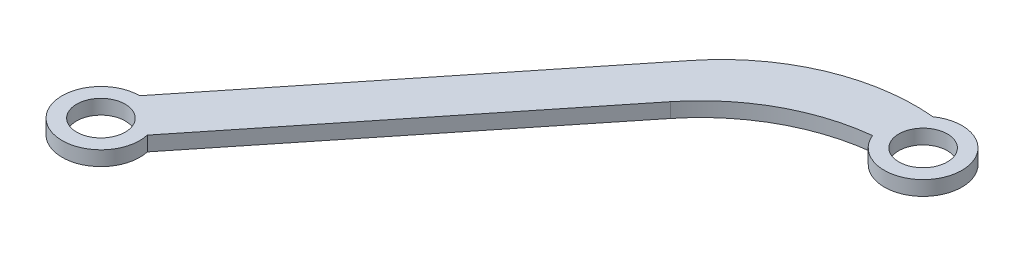
ISO-10303-21;
HEADER;
FILE_DESCRIPTION(('STEP AP214'),'2;1');
FILE_NAME('part.step','',(''),(''),'','','');
FILE_SCHEMA(('AUTOMOTIVE_DESIGN { 1 0 10303 214 1 1 1 1 }'));
ENDSEC;
DATA;
#1=APPLICATION_CONTEXT('core data for automotive mechanical design processes');
#2=APPLICATION_PROTOCOL_DEFINITION('international standard','automotive_design',2000,#1);
#3=PRODUCT_CONTEXT('',#1,'mechanical');
#4=PRODUCT('Part','Part','',(#3));
#5=PRODUCT_RELATED_PRODUCT_CATEGORY('part','',(#4));
#6=PRODUCT_DEFINITION_FORMATION('','',#4);
#7=PRODUCT_DEFINITION_CONTEXT('part definition',#1,'design');
#8=PRODUCT_DEFINITION('design','',#6,#7);
#9=PRODUCT_DEFINITION_SHAPE('','',#8);
#10=(LENGTH_UNIT() NAMED_UNIT(*) SI_UNIT(.MILLI.,.METRE.));
#11=(NAMED_UNIT(*) PLANE_ANGLE_UNIT() SI_UNIT($,.RADIAN.));
#12=(NAMED_UNIT(*) SI_UNIT($,.STERADIAN.) SOLID_ANGLE_UNIT());
#13=UNCERTAINTY_MEASURE_WITH_UNIT(LENGTH_MEASURE(1.E-05),#10,'distance_accuracy_value','');
#14=(GEOMETRIC_REPRESENTATION_CONTEXT(3) GLOBAL_UNCERTAINTY_ASSIGNED_CONTEXT((#13)) GLOBAL_UNIT_ASSIGNED_CONTEXT((#10,
#11,#12)) REPRESENTATION_CONTEXT('',''));
#15=CARTESIAN_POINT('',(0.,0.,0.));
#16=DIRECTION('',(0.,0.,1.));
#17=DIRECTION('',(1.,0.,0.));
#18=AXIS2_PLACEMENT_3D('',#15,#16,#17);
#19=CARTESIAN_POINT('',(-23.1363919626679,3.,-12.1400803398292));
#20=DIRECTION('',(0.7806247497998,0.,0.624999999999999));
#21=DIRECTION('',(0.624999999999999,0.,-0.7806247497998));
#22=AXIS2_PLACEMENT_3D('',#19,#20,#21);
#23=PLANE('',#22);
#24=DIRECTION('',(-0.624999999999999,0.,0.7806247497998));
#25=VECTOR('',#24,1.);
#26=CARTESIAN_POINT('',(-23.1363919626679,3.,-12.1400803398292));
#27=LINE('',#26,#25);
#28=CARTESIAN_POINT('',(-39.4613029698778,3.,8.24972697298238));
#29=VERTEX_POINT('',#28);
#30=CARTESIAN_POINT('',(-90.,3.,71.3725393319377));
#31=VERTEX_POINT('',#30);
#32=EDGE_CURVE('E93',#29,#31,#27,.T.);
#33=ORIENTED_EDGE('',*,*,#32,.F.);
#34=DIRECTION('',(0.,-1.,0.));
#35=VECTOR('',#34,1.);
#36=CARTESIAN_POINT('',(-39.4613029698778,3.,8.24972697298239));
#37=LINE('',#36,#35);
#38=CARTESIAN_POINT('',(-39.4613029698778,0.,8.24972697298238));
#39=VERTEX_POINT('',#38);
#40=EDGE_CURVE('E117',#29,#39,#37,.T.);
#41=ORIENTED_EDGE('',*,*,#40,.T.);
#42=DIRECTION('',(-0.624999999999999,0.,0.7806247497998));
#43=VECTOR('',#42,1.);
#44=CARTESIAN_POINT('',(-23.1363919626679,0.,-12.1400803398292));
#45=LINE('',#44,#43);
#46=CARTESIAN_POINT('',(-90.,0.,71.3725393319377));
#47=VERTEX_POINT('',#46);
#48=EDGE_CURVE('E115',#39,#47,#45,.T.);
#49=ORIENTED_EDGE('',*,*,#48,.T.);
#50=DIRECTION('',(0.,-1.,0.));
#51=VECTOR('',#50,1.);
#52=CARTESIAN_POINT('',(-90.,3.,71.3725393319377));
#53=LINE('',#52,#51);
#54=EDGE_CURVE('E109',#31,#47,#53,.T.);
#55=ORIENTED_EDGE('',*,*,#54,.F.);
#56=EDGE_LOOP('',(#33,#41,#49,#55));
#57=FACE_BOUND('',#56,.T.);
#58=ADVANCED_FACE('F39',(#57),#23,.F.);
#59=CARTESIAN_POINT('',(-90.,3.,79.3725393319377));
#60=DIRECTION('',(0.,-1.,0.));
#61=DIRECTION('',(0.,0.,-1.));
#62=AXIS2_PLACEMENT_3D('',#59,#60,#61);
#63=CYLINDRICAL_SURFACE('',#62,8.);
#64=CARTESIAN_POINT('',(-90.,0.,79.3725393319377));
#65=DIRECTION('',(0.,1.,0.));
#66=DIRECTION('',(0.,0.,1.));
#67=AXIS2_PLACEMENT_3D('',#64,#65,#66);
#68=CIRCLE('',#67,8.);
#69=CARTESIAN_POINT('',(-82.193752502002,0.,77.6225393319377));
#70=VERTEX_POINT('',#69);
#71=EDGE_CURVE('E133',#47,#70,#68,.T.);
#72=ORIENTED_EDGE('',*,*,#71,.T.);
#73=DIRECTION('',(0.,-1.,0.));
#74=VECTOR('',#73,1.);
#75=CARTESIAN_POINT('',(-82.193752502002,3.,77.6225393319377));
#76=LINE('',#75,#74);
#77=CARTESIAN_POINT('',(-82.193752502002,3.,77.6225393319377));
#78=VERTEX_POINT('',#77);
#79=EDGE_CURVE('E111',#78,#70,#76,.T.);
#80=ORIENTED_EDGE('',*,*,#79,.F.);
#81=CARTESIAN_POINT('',(-90.,3.,79.3725393319377));
#82=DIRECTION('',(0.,1.,0.));
#83=DIRECTION('',(0.,0.,1.));
#84=AXIS2_PLACEMENT_3D('',#81,#82,#83);
#85=CIRCLE('',#84,8.);
#86=EDGE_CURVE('E96',#31,#78,#85,.T.);
#87=ORIENTED_EDGE('',*,*,#86,.F.);
#88=ORIENTED_EDGE('',*,*,#54,.T.);
#89=EDGE_LOOP('',(#72,#80,#87,#88));
#90=FACE_BOUND('',#89,.T.);
#91=ADVANCED_FACE('F108',(#90),#63,.T.);
#92=CARTESIAN_POINT('',(-82.193752502002,3.,77.6225393319377));
#93=DIRECTION('',(-0.7806247497998,0.,-0.624999999999999));
#94=DIRECTION('',(-0.624999999999999,0.,0.7806247497998));
#95=AXIS2_PLACEMENT_3D('',#92,#93,#94);
#96=PLANE('',#95);
#97=DIRECTION('',(0.624999999999999,0.,-0.7806247497998));
#98=VECTOR('',#97,1.);
#99=CARTESIAN_POINT('',(-82.193752502002,0.,77.6225393319377));
#100=LINE('',#99,#98);
#101=CARTESIAN_POINT('',(-34.265723692893,0.,17.7604505359243));
#102=VERTEX_POINT('',#101);
#103=EDGE_CURVE('E148',#70,#102,#100,.T.);
#104=ORIENTED_EDGE('',*,*,#103,.T.);
#105=DIRECTION('',(0.,-1.,0.));
#106=VECTOR('',#105,1.);
#107=CARTESIAN_POINT('',(-34.265723692893,3.,17.7604505359243));
#108=LINE('',#107,#106);
#109=CARTESIAN_POINT('',(-34.265723692893,3.,17.7604505359243));
#110=VERTEX_POINT('',#109);
#111=EDGE_CURVE('E56',#102,#110,#108,.F.);
#112=ORIENTED_EDGE('',*,*,#111,.T.);
#113=DIRECTION('',(0.624999999999999,0.,-0.7806247497998));
#114=VECTOR('',#113,1.);
#115=CARTESIAN_POINT('',(-82.193752502002,3.,77.6225393319377));
#116=LINE('',#115,#114);
#117=EDGE_CURVE('E112',#78,#110,#116,.T.);
#118=ORIENTED_EDGE('',*,*,#117,.F.);
#119=ORIENTED_EDGE('',*,*,#79,.T.);
#120=EDGE_LOOP('',(#104,#112,#118,#119));
#121=FACE_BOUND('',#120,.T.);
#122=ADVANCED_FACE('F179',(#121),#96,.F.);
#123=CARTESIAN_POINT('',(0.,3.,0.));
#124=DIRECTION('',(0.,-1.,0.));
#125=DIRECTION('',(0.,0.,-1.));
#126=AXIS2_PLACEMENT_3D('',#123,#124,#125);
#127=CYLINDRICAL_SURFACE('',#126,8.);
#128=CARTESIAN_POINT('',(0.,0.,0.));
#129=DIRECTION('',(0.,1.,0.));
#130=DIRECTION('',(0.,0.,1.));
#131=AXIS2_PLACEMENT_3D('',#128,#129,#130);
#132=CIRCLE('',#131,8.);
#133=CARTESIAN_POINT('',(-7.41601282468284,0.,3.00045892892064));
#134=VERTEX_POINT('',#133);
#135=CARTESIAN_POINT('',(-4.55004343124093,0.,-6.5800535540238));
#136=VERTEX_POINT('',#135);
#137=EDGE_CURVE('E104',#134,#136,#132,.T.);
#138=ORIENTED_EDGE('',*,*,#137,.T.);
#139=DIRECTION('',(0.,-1.,0.));
#140=VECTOR('',#139,1.);
#141=CARTESIAN_POINT('',(-4.55004343124093,3.,-6.5800535540238));
#142=LINE('',#141,#140);
#143=CARTESIAN_POINT('',(-4.55004343124093,3.,-6.5800535540238));
#144=VERTEX_POINT('',#143);
#145=EDGE_CURVE('E145',#144,#136,#142,.T.);
#146=ORIENTED_EDGE('',*,*,#145,.F.);
#147=CARTESIAN_POINT('',(0.,3.,0.));
#148=DIRECTION('',(0.,1.,0.));
#149=DIRECTION('',(0.,0.,1.));
#150=AXIS2_PLACEMENT_3D('',#147,#148,#149);
#151=CIRCLE('',#150,8.);
#152=CARTESIAN_POINT('',(-7.41601282468284,3.,3.00045892892064));
#153=VERTEX_POINT('',#152);
#154=EDGE_CURVE('E144',#153,#144,#151,.T.);
#155=ORIENTED_EDGE('',*,*,#154,.F.);
#156=DIRECTION('',(0.,-1.,0.));
#157=VECTOR('',#156,1.);
#158=CARTESIAN_POINT('',(-7.41601282468284,3.,3.00045892892064));
#159=LINE('',#158,#157);
#160=EDGE_CURVE('E121',#153,#134,#159,.T.);
#161=ORIENTED_EDGE('',*,*,#160,.T.);
#162=EDGE_LOOP('',(#138,#146,#155,#161));
#163=FACE_BOUND('',#162,.T.);
#164=ADVANCED_FACE('F157',(#163),#127,.T.);
#165=CARTESIAN_POINT('',(-90.,3.,79.3725393319377));
#166=DIRECTION('',(0.,1.,0.));
#167=DIRECTION('',(0.,0.,1.));
#168=AXIS2_PLACEMENT_3D('',#165,#166,#167);
#169=PLANE('',#168);
#170=CARTESIAN_POINT('',(0.,3.,0.));
#171=DIRECTION('',(0.,1.,0.));
#172=DIRECTION('',(0.,0.,1.));
#173=AXIS2_PLACEMENT_3D('',#170,#171,#172);
#174=CIRCLE('',#173,5.);
#175=CARTESIAN_POINT('',(0.,3.,5.));
#176=VERTEX_POINT('',#175);
#177=EDGE_CURVE('E140',#176,#176,#174,.T.);
#178=ORIENTED_EDGE('',*,*,#177,.F.);
#179=EDGE_LOOP('',(#178));
#180=FACE_BOUND('',#179,.T.);
#181=CARTESIAN_POINT('',(-90.,3.,79.3725393319377));
#182=DIRECTION('',(0.,1.,0.));
#183=DIRECTION('',(0.,0.,1.));
#184=AXIS2_PLACEMENT_3D('',#181,#182,#183);
#185=CIRCLE('',#184,5.00000000000001);
#186=CARTESIAN_POINT('',(-90.,3.,84.3725393319377));
#187=VERTEX_POINT('',#186);
#188=EDGE_CURVE('E130',#187,#187,#185,.T.);
#189=ORIENTED_EDGE('',*,*,#188,.F.);
#190=EDGE_LOOP('',(#189));
#191=FACE_BOUND('',#190,.T.);
#192=ORIENTED_EDGE('',*,*,#154,.T.);
#193=CARTESIAN_POINT('',(-8.23631297788578,3.,33.2497269729824));
#194=DIRECTION('',(0.,1.,0.));
#195=DIRECTION('',(0.,0.,1.));
#196=AXIS2_PLACEMENT_3D('',#193,#194,#195);
#197=CIRCLE('',#196,40.);
#198=EDGE_CURVE('E99',#144,#29,#197,.T.);
#199=ORIENTED_EDGE('',*,*,#198,.T.);
#200=ORIENTED_EDGE('',*,*,#32,.T.);
#201=ORIENTED_EDGE('',*,*,#86,.T.);
#202=ORIENTED_EDGE('',*,*,#117,.T.);
#203=CARTESIAN_POINT('',(-3.04073370090097,3.,42.7604505359243));
#204=DIRECTION('',(0.,1.,0.));
#205=DIRECTION('',(0.,0.,1.));
#206=AXIS2_PLACEMENT_3D('',#203,#204,#205);
#207=CIRCLE('',#206,40.);
#208=EDGE_CURVE('E11',#110,#153,#207,.F.);
#209=ORIENTED_EDGE('',*,*,#208,.T.);
#210=EDGE_LOOP('',(#192,#199,#200,#201,#202,#209));
#211=FACE_BOUND('',#210,.T.);
#212=ADVANCED_FACE('F95',(#180,#191,#211),#169,.T.);
#213=CARTESIAN_POINT('',(-90.,0.,79.3725393319377));
#214=DIRECTION('',(0.,1.,0.));
#215=DIRECTION('',(0.,0.,1.));
#216=AXIS2_PLACEMENT_3D('',#213,#214,#215);
#217=PLANE('',#216);
#218=CARTESIAN_POINT('',(0.,0.,0.));
#219=DIRECTION('',(0.,1.,0.));
#220=DIRECTION('',(0.,0.,1.));
#221=AXIS2_PLACEMENT_3D('',#218,#219,#220);
#222=CIRCLE('',#221,5.);
#223=CARTESIAN_POINT('',(0.,0.,5.));
#224=VERTEX_POINT('',#223);
#225=EDGE_CURVE('E43',#224,#224,#222,.T.);
#226=ORIENTED_EDGE('',*,*,#225,.T.);
#227=EDGE_LOOP('',(#226));
#228=FACE_BOUND('',#227,.T.);
#229=CARTESIAN_POINT('',(-90.,0.,79.3725393319377));
#230=DIRECTION('',(0.,1.,0.));
#231=DIRECTION('',(0.,0.,1.));
#232=AXIS2_PLACEMENT_3D('',#229,#230,#231);
#233=CIRCLE('',#232,5.00000000000001);
#234=CARTESIAN_POINT('',(-90.,0.,84.3725393319377));
#235=VERTEX_POINT('',#234);
#236=EDGE_CURVE('E128',#235,#235,#233,.T.);
#237=ORIENTED_EDGE('',*,*,#236,.T.);
#238=EDGE_LOOP('',(#237));
#239=FACE_BOUND('',#238,.T.);
#240=ORIENTED_EDGE('',*,*,#48,.F.);
#241=CARTESIAN_POINT('',(-8.23631297788578,0.,33.2497269729824));
#242=DIRECTION('',(0.,1.,0.));
#243=DIRECTION('',(0.,0.,1.));
#244=AXIS2_PLACEMENT_3D('',#241,#242,#243);
#245=CIRCLE('',#244,40.);
#246=EDGE_CURVE('E119',#39,#136,#245,.F.);
#247=ORIENTED_EDGE('',*,*,#246,.T.);
#248=ORIENTED_EDGE('',*,*,#137,.F.);
#249=CARTESIAN_POINT('',(-3.04073370090097,0.,42.7604505359243));
#250=DIRECTION('',(0.,1.,0.));
#251=DIRECTION('',(0.,0.,1.));
#252=AXIS2_PLACEMENT_3D('',#249,#250,#251);
#253=CIRCLE('',#252,40.);
#254=EDGE_CURVE('E48',#134,#102,#253,.T.);
#255=ORIENTED_EDGE('',*,*,#254,.T.);
#256=ORIENTED_EDGE('',*,*,#103,.F.);
#257=ORIENTED_EDGE('',*,*,#71,.F.);
#258=EDGE_LOOP('',(#240,#247,#248,#255,#256,#257));
#259=FACE_BOUND('',#258,.T.);
#260=ADVANCED_FACE('F161',(#228,#239,#259),#217,.F.);
#261=CARTESIAN_POINT('',(-8.23631297788578,3.,33.2497269729824));
#262=DIRECTION('',(0.,-1.,0.));
#263=DIRECTION('',(0.,0.,-1.));
#264=AXIS2_PLACEMENT_3D('',#261,#262,#263);
#265=CYLINDRICAL_SURFACE('',#264,40.);
#266=ORIENTED_EDGE('',*,*,#198,.F.);
#267=ORIENTED_EDGE('',*,*,#145,.T.);
#268=ORIENTED_EDGE('',*,*,#246,.F.);
#269=ORIENTED_EDGE('',*,*,#40,.F.);
#270=EDGE_LOOP('',(#266,#267,#268,#269));
#271=FACE_BOUND('',#270,.T.);
#272=ADVANCED_FACE('F163',(#271),#265,.T.);
#273=CARTESIAN_POINT('',(-3.04073370090097,3.,42.7604505359243));
#274=DIRECTION('',(0.,-1.,0.));
#275=DIRECTION('',(0.,0.,-1.));
#276=AXIS2_PLACEMENT_3D('',#273,#274,#275);
#277=CYLINDRICAL_SURFACE('',#276,40.);
#278=ORIENTED_EDGE('',*,*,#208,.F.);
#279=ORIENTED_EDGE('',*,*,#111,.F.);
#280=ORIENTED_EDGE('',*,*,#254,.F.);
#281=ORIENTED_EDGE('',*,*,#160,.F.);
#282=EDGE_LOOP('',(#278,#279,#280,#281));
#283=FACE_BOUND('',#282,.T.);
#284=ADVANCED_FACE('F41',(#283),#277,.F.);
#285=CARTESIAN_POINT('',(-90.,-2.,79.3725393319377));
#286=DIRECTION('',(0.,1.,0.));
#287=DIRECTION('',(0.,0.,1.));
#288=AXIS2_PLACEMENT_3D('',#285,#286,#287);
#289=CYLINDRICAL_SURFACE('',#288,5.00000000000001);
#290=ORIENTED_EDGE('',*,*,#188,.T.);
#291=EDGE_LOOP('',(#290));
#292=FACE_BOUND('',#291,.T.);
#293=ORIENTED_EDGE('',*,*,#236,.F.);
#294=EDGE_LOOP('',(#293));
#295=FACE_BOUND('',#294,.T.);
#296=ADVANCED_FACE('F169',(#292,#295),#289,.F.);
#297=CARTESIAN_POINT('',(0.,-2.,0.));
#298=DIRECTION('',(0.,1.,0.));
#299=DIRECTION('',(0.,0.,1.));
#300=AXIS2_PLACEMENT_3D('',#297,#298,#299);
#301=CYLINDRICAL_SURFACE('',#300,5.);
#302=ORIENTED_EDGE('',*,*,#177,.T.);
#303=EDGE_LOOP('',(#302));
#304=FACE_BOUND('',#303,.T.);
#305=ORIENTED_EDGE('',*,*,#225,.F.);
#306=EDGE_LOOP('',(#305));
#307=FACE_BOUND('',#306,.T.);
#308=ADVANCED_FACE('F189',(#304,#307),#301,.F.);
#309=CLOSED_SHELL('',(#58,#91,#122,#164,#212,#260,#272,#284,#296,#308));
#310=MANIFOLD_SOLID_BREP('B2',#309);
#311=ADVANCED_BREP_SHAPE_REPRESENTATION('',(#18,#310),#14);
#312=SHAPE_DEFINITION_REPRESENTATION(#9,#311);
ENDSEC;
END-ISO-10303-21;
